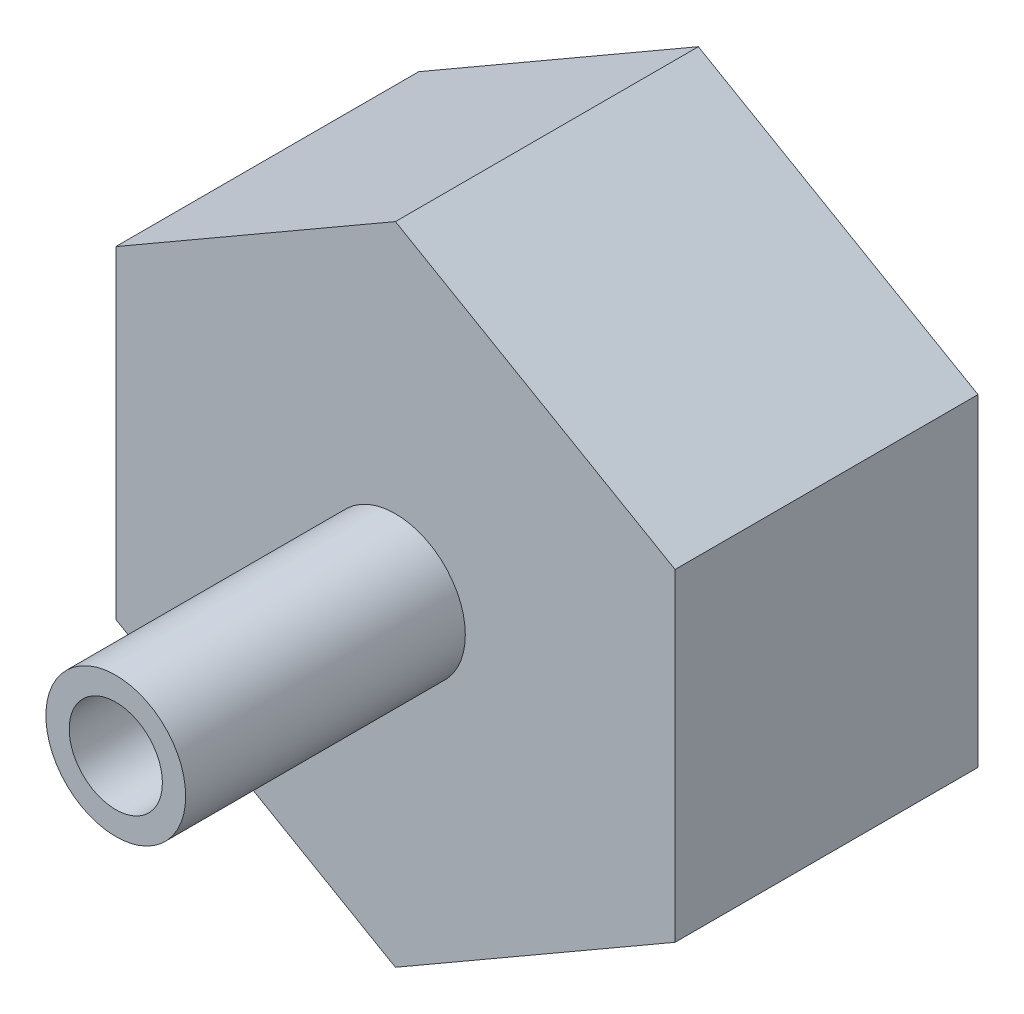
ISO-10303-21;
HEADER;
FILE_DESCRIPTION(('STEP AP214'),'2;1');
FILE_NAME('part.step','',(''),(''),'','','');
FILE_SCHEMA(('AUTOMOTIVE_DESIGN { 1 0 10303 214 1 1 1 1 }'));
ENDSEC;
DATA;
#1=APPLICATION_CONTEXT('core data for automotive mechanical design processes');
#2=APPLICATION_PROTOCOL_DEFINITION('international standard','automotive_design',2000,#1);
#3=PRODUCT_CONTEXT('',#1,'mechanical');
#4=PRODUCT('Part','Part','',(#3));
#5=PRODUCT_RELATED_PRODUCT_CATEGORY('part','',(#4));
#6=PRODUCT_DEFINITION_FORMATION('','',#4);
#7=PRODUCT_DEFINITION_CONTEXT('part definition',#1,'design');
#8=PRODUCT_DEFINITION('design','',#6,#7);
#9=PRODUCT_DEFINITION_SHAPE('','',#8);
#10=(LENGTH_UNIT() NAMED_UNIT(*) SI_UNIT(.MILLI.,.METRE.));
#11=(NAMED_UNIT(*) PLANE_ANGLE_UNIT() SI_UNIT($,.RADIAN.));
#12=(NAMED_UNIT(*) SI_UNIT($,.STERADIAN.) SOLID_ANGLE_UNIT());
#13=UNCERTAINTY_MEASURE_WITH_UNIT(LENGTH_MEASURE(1.E-05),#10,'distance_accuracy_value','');
#14=(GEOMETRIC_REPRESENTATION_CONTEXT(3) GLOBAL_UNCERTAINTY_ASSIGNED_CONTEXT((#13)) GLOBAL_UNIT_ASSIGNED_CONTEXT((#10,
#11,#12)) REPRESENTATION_CONTEXT('',''));
#15=CARTESIAN_POINT('',(0.,0.,0.));
#16=DIRECTION('',(0.,0.,1.));
#17=DIRECTION('',(1.,0.,0.));
#18=AXIS2_PLACEMENT_3D('',#15,#16,#17);
#19=CARTESIAN_POINT('',(12.,-6.92820323027552,13.));
#20=DIRECTION('',(-1.,0.,0.));
#21=DIRECTION('',(0.,-1.,0.));
#22=AXIS2_PLACEMENT_3D('',#19,#20,#21);
#23=PLANE('',#22);
#24=DIRECTION('',(0.,1.,0.));
#25=VECTOR('',#24,1.);
#26=CARTESIAN_POINT('',(12.,-6.92820323027552,0.));
#27=LINE('',#26,#25);
#28=CARTESIAN_POINT('',(12.,-6.92820323027552,0.));
#29=VERTEX_POINT('',#28);
#30=CARTESIAN_POINT('',(12.,6.92820323027551,0.));
#31=VERTEX_POINT('',#30);
#32=EDGE_CURVE('E129',#29,#31,#27,.T.);
#33=ORIENTED_EDGE('',*,*,#32,.T.);
#34=DIRECTION('',(0.,0.,-1.));
#35=VECTOR('',#34,1.);
#36=CARTESIAN_POINT('',(12.,6.92820323027551,13.));
#37=LINE('',#36,#35);
#38=CARTESIAN_POINT('',(12.,6.92820323027551,13.));
#39=VERTEX_POINT('',#38);
#40=EDGE_CURVE('E46',#39,#31,#37,.T.);
#41=ORIENTED_EDGE('',*,*,#40,.F.);
#42=DIRECTION('',(0.,1.,0.));
#43=VECTOR('',#42,1.);
#44=CARTESIAN_POINT('',(12.,-6.92820323027552,13.));
#45=LINE('',#44,#43);
#46=CARTESIAN_POINT('',(12.,-6.92820323027552,13.));
#47=VERTEX_POINT('',#46);
#48=EDGE_CURVE('E138',#47,#39,#45,.T.);
#49=ORIENTED_EDGE('',*,*,#48,.F.);
#50=DIRECTION('',(0.,0.,-1.));
#51=VECTOR('',#50,1.);
#52=CARTESIAN_POINT('',(12.,-6.92820323027552,13.));
#53=LINE('',#52,#51);
#54=EDGE_CURVE('E123',#47,#29,#53,.T.);
#55=ORIENTED_EDGE('',*,*,#54,.T.);
#56=EDGE_LOOP('',(#33,#41,#49,#55));
#57=FACE_BOUND('',#56,.T.);
#58=ADVANCED_FACE('F43',(#57),#23,.F.);
#59=CARTESIAN_POINT('',(12.,6.92820323027551,13.));
#60=DIRECTION('',(-0.5,-0.866025403784439,0.));
#61=DIRECTION('',(0.866025403784439,-0.5,0.));
#62=AXIS2_PLACEMENT_3D('',#59,#60,#61);
#63=PLANE('',#62);
#64=DIRECTION('',(-0.866025403784439,0.5,0.));
#65=VECTOR('',#64,1.);
#66=CARTESIAN_POINT('',(12.,6.92820323027551,0.));
#67=LINE('',#66,#65);
#68=CARTESIAN_POINT('',(0.,13.856406460551,0.));
#69=VERTEX_POINT('',#68);
#70=EDGE_CURVE('E135',#31,#69,#67,.T.);
#71=ORIENTED_EDGE('',*,*,#70,.T.);
#72=DIRECTION('',(0.,0.,-1.));
#73=VECTOR('',#72,1.);
#74=CARTESIAN_POINT('',(0.,13.856406460551,13.));
#75=LINE('',#74,#73);
#76=CARTESIAN_POINT('',(0.,13.856406460551,13.));
#77=VERTEX_POINT('',#76);
#78=EDGE_CURVE('E141',#77,#69,#75,.T.);
#79=ORIENTED_EDGE('',*,*,#78,.F.);
#80=DIRECTION('',(-0.866025403784439,0.5,0.));
#81=VECTOR('',#80,1.);
#82=CARTESIAN_POINT('',(12.,6.92820323027551,13.));
#83=LINE('',#82,#81);
#84=EDGE_CURVE('E98',#39,#77,#83,.T.);
#85=ORIENTED_EDGE('',*,*,#84,.F.);
#86=ORIENTED_EDGE('',*,*,#40,.T.);
#87=EDGE_LOOP('',(#71,#79,#85,#86));
#88=FACE_BOUND('',#87,.T.);
#89=ADVANCED_FACE('F146',(#88),#63,.F.);
#90=CARTESIAN_POINT('',(0.,13.856406460551,13.));
#91=DIRECTION('',(0.5,-0.866025403784439,0.));
#92=DIRECTION('',(0.866025403784439,0.5,0.));
#93=AXIS2_PLACEMENT_3D('',#90,#91,#92);
#94=PLANE('',#93);
#95=DIRECTION('',(-0.866025403784439,-0.5,0.));
#96=VECTOR('',#95,1.);
#97=CARTESIAN_POINT('',(0.,13.856406460551,0.));
#98=LINE('',#97,#96);
#99=CARTESIAN_POINT('',(-12.,6.92820323027551,0.));
#100=VERTEX_POINT('',#99);
#101=EDGE_CURVE('E134',#69,#100,#98,.T.);
#102=ORIENTED_EDGE('',*,*,#101,.T.);
#103=DIRECTION('',(0.,0.,-1.));
#104=VECTOR('',#103,1.);
#105=CARTESIAN_POINT('',(-12.,6.92820323027551,13.));
#106=LINE('',#105,#104);
#107=CARTESIAN_POINT('',(-12.,6.92820323027551,13.));
#108=VERTEX_POINT('',#107);
#109=EDGE_CURVE('E119',#108,#100,#106,.T.);
#110=ORIENTED_EDGE('',*,*,#109,.F.);
#111=DIRECTION('',(-0.866025403784439,-0.5,0.));
#112=VECTOR('',#111,1.);
#113=CARTESIAN_POINT('',(0.,13.856406460551,13.));
#114=LINE('',#113,#112);
#115=EDGE_CURVE('E112',#77,#108,#114,.T.);
#116=ORIENTED_EDGE('',*,*,#115,.F.);
#117=ORIENTED_EDGE('',*,*,#78,.T.);
#118=EDGE_LOOP('',(#102,#110,#116,#117));
#119=FACE_BOUND('',#118,.T.);
#120=ADVANCED_FACE('F152',(#119),#94,.F.);
#121=CARTESIAN_POINT('',(-12.,6.92820323027551,13.));
#122=DIRECTION('',(1.,0.,0.));
#123=DIRECTION('',(0.,1.,0.));
#124=AXIS2_PLACEMENT_3D('',#121,#122,#123);
#125=PLANE('',#124);
#126=DIRECTION('',(0.,-1.,0.));
#127=VECTOR('',#126,1.);
#128=CARTESIAN_POINT('',(-12.,6.92820323027551,0.));
#129=LINE('',#128,#127);
#130=CARTESIAN_POINT('',(-12.,-6.92820323027551,0.));
#131=VERTEX_POINT('',#130);
#132=EDGE_CURVE('E117',#100,#131,#129,.T.);
#133=ORIENTED_EDGE('',*,*,#132,.T.);
#134=DIRECTION('',(0.,0.,-1.));
#135=VECTOR('',#134,1.);
#136=CARTESIAN_POINT('',(-12.,-6.92820323027551,13.));
#137=LINE('',#136,#135);
#138=CARTESIAN_POINT('',(-12.,-6.92820323027551,13.));
#139=VERTEX_POINT('',#138);
#140=EDGE_CURVE('E118',#139,#131,#137,.T.);
#141=ORIENTED_EDGE('',*,*,#140,.F.);
#142=DIRECTION('',(0.,-1.,0.));
#143=VECTOR('',#142,1.);
#144=CARTESIAN_POINT('',(-12.,6.92820323027551,13.));
#145=LINE('',#144,#143);
#146=EDGE_CURVE('E104',#108,#139,#145,.T.);
#147=ORIENTED_EDGE('',*,*,#146,.F.);
#148=ORIENTED_EDGE('',*,*,#109,.T.);
#149=EDGE_LOOP('',(#133,#141,#147,#148));
#150=FACE_BOUND('',#149,.T.);
#151=ADVANCED_FACE('F120',(#150),#125,.F.);
#152=CARTESIAN_POINT('',(-12.,-6.92820323027551,13.));
#153=DIRECTION('',(0.5,0.866025403784439,0.));
#154=DIRECTION('',(-0.866025403784439,0.5,0.));
#155=AXIS2_PLACEMENT_3D('',#152,#153,#154);
#156=PLANE('',#155);
#157=DIRECTION('',(0.866025403784439,-0.5,0.));
#158=VECTOR('',#157,1.);
#159=CARTESIAN_POINT('',(-12.,-6.92820323027551,0.));
#160=LINE('',#159,#158);
#161=CARTESIAN_POINT('',(0.,-13.856406460551,0.));
#162=VERTEX_POINT('',#161);
#163=EDGE_CURVE('E85',#131,#162,#160,.T.);
#164=ORIENTED_EDGE('',*,*,#163,.T.);
#165=DIRECTION('',(0.,0.,-1.));
#166=VECTOR('',#165,1.);
#167=CARTESIAN_POINT('',(0.,-13.856406460551,13.));
#168=LINE('',#167,#166);
#169=CARTESIAN_POINT('',(0.,-13.856406460551,13.));
#170=VERTEX_POINT('',#169);
#171=EDGE_CURVE('E122',#170,#162,#168,.T.);
#172=ORIENTED_EDGE('',*,*,#171,.F.);
#173=DIRECTION('',(0.866025403784439,-0.5,0.));
#174=VECTOR('',#173,1.);
#175=CARTESIAN_POINT('',(-12.,-6.92820323027551,13.));
#176=LINE('',#175,#174);
#177=EDGE_CURVE('E108',#139,#170,#176,.T.);
#178=ORIENTED_EDGE('',*,*,#177,.F.);
#179=ORIENTED_EDGE('',*,*,#140,.T.);
#180=EDGE_LOOP('',(#164,#172,#178,#179));
#181=FACE_BOUND('',#180,.T.);
#182=ADVANCED_FACE('F125',(#181),#156,.F.);
#183=CARTESIAN_POINT('',(0.,-13.856406460551,13.));
#184=DIRECTION('',(-0.5,0.866025403784439,0.));
#185=DIRECTION('',(-0.866025403784439,-0.5,0.));
#186=AXIS2_PLACEMENT_3D('',#183,#184,#185);
#187=PLANE('',#186);
#188=DIRECTION('',(0.866025403784439,0.5,0.));
#189=VECTOR('',#188,1.);
#190=CARTESIAN_POINT('',(0.,-13.856406460551,0.));
#191=LINE('',#190,#189);
#192=EDGE_CURVE('E90',#162,#29,#191,.T.);
#193=ORIENTED_EDGE('',*,*,#192,.T.);
#194=ORIENTED_EDGE('',*,*,#54,.F.);
#195=DIRECTION('',(0.866025403784439,0.5,0.));
#196=VECTOR('',#195,1.);
#197=CARTESIAN_POINT('',(0.,-13.856406460551,13.));
#198=LINE('',#197,#196);
#199=EDGE_CURVE('E58',#170,#47,#198,.T.);
#200=ORIENTED_EDGE('',*,*,#199,.F.);
#201=ORIENTED_EDGE('',*,*,#171,.T.);
#202=EDGE_LOOP('',(#193,#194,#200,#201));
#203=FACE_BOUND('',#202,.T.);
#204=ADVANCED_FACE('F189',(#203),#187,.F.);
#205=CARTESIAN_POINT('',(0.,0.,13.));
#206=DIRECTION('',(0.,0.,1.));
#207=DIRECTION('',(1.,0.,0.));
#208=AXIS2_PLACEMENT_3D('',#205,#206,#207);
#209=PLANE('',#208);
#210=CARTESIAN_POINT('',(0.,0.,13.));
#211=DIRECTION('',(0.,0.,1.));
#212=DIRECTION('',(1.,0.,0.));
#213=AXIS2_PLACEMENT_3D('',#210,#211,#212);
#214=CIRCLE('',#213,3.);
#215=CARTESIAN_POINT('',(3.,0.,13.));
#216=VERTEX_POINT('',#215);
#217=EDGE_CURVE('E11',#216,#216,#214,.T.);
#218=ORIENTED_EDGE('',*,*,#217,.F.);
#219=EDGE_LOOP('',(#218));
#220=FACE_BOUND('',#219,.T.);
#221=ORIENTED_EDGE('',*,*,#48,.T.);
#222=ORIENTED_EDGE('',*,*,#84,.T.);
#223=ORIENTED_EDGE('',*,*,#115,.T.);
#224=ORIENTED_EDGE('',*,*,#146,.T.);
#225=ORIENTED_EDGE('',*,*,#177,.T.);
#226=ORIENTED_EDGE('',*,*,#199,.T.);
#227=EDGE_LOOP('',(#221,#222,#223,#224,#225,#226));
#228=FACE_BOUND('',#227,.T.);
#229=ADVANCED_FACE('F110',(#220,#228),#209,.T.);
#230=CARTESIAN_POINT('',(0.,0.,0.));
#231=DIRECTION('',(0.,0.,1.));
#232=DIRECTION('',(1.,0.,0.));
#233=AXIS2_PLACEMENT_3D('',#230,#231,#232);
#234=PLANE('',#233);
#235=CARTESIAN_POINT('',(0.,0.,0.));
#236=DIRECTION('',(0.,0.,1.));
#237=DIRECTION('',(1.,0.,0.));
#238=AXIS2_PLACEMENT_3D('',#235,#236,#237);
#239=CIRCLE('',#238,10.4775);
#240=CARTESIAN_POINT('',(10.4775,0.,0.));
#241=VERTEX_POINT('',#240);
#242=EDGE_CURVE('E158',#241,#241,#239,.T.);
#243=ORIENTED_EDGE('',*,*,#242,.T.);
#244=EDGE_LOOP('',(#243));
#245=FACE_BOUND('',#244,.T.);
#246=ORIENTED_EDGE('',*,*,#32,.F.);
#247=ORIENTED_EDGE('',*,*,#192,.F.);
#248=ORIENTED_EDGE('',*,*,#163,.F.);
#249=ORIENTED_EDGE('',*,*,#132,.F.);
#250=ORIENTED_EDGE('',*,*,#101,.F.);
#251=ORIENTED_EDGE('',*,*,#70,.F.);
#252=EDGE_LOOP('',(#246,#247,#248,#249,#250,#251));
#253=FACE_BOUND('',#252,.T.);
#254=ADVANCED_FACE('F153',(#245,#253),#234,.F.);
#255=CARTESIAN_POINT('',(0.,0.,11.));
#256=DIRECTION('',(0.,0.,-1.));
#257=DIRECTION('',(-1.,0.,0.));
#258=AXIS2_PLACEMENT_3D('',#255,#256,#257);
#259=CYLINDRICAL_SURFACE('',#258,10.4775);
#260=CARTESIAN_POINT('',(0.,0.,11.));
#261=DIRECTION('',(0.,0.,1.));
#262=DIRECTION('',(1.,0.,0.));
#263=AXIS2_PLACEMENT_3D('',#260,#261,#262);
#264=CIRCLE('',#263,10.4775);
#265=CARTESIAN_POINT('',(10.4775,0.,11.));
#266=VERTEX_POINT('',#265);
#267=EDGE_CURVE('E131',#266,#266,#264,.T.);
#268=ORIENTED_EDGE('',*,*,#267,.T.);
#269=EDGE_LOOP('',(#268));
#270=FACE_BOUND('',#269,.T.);
#271=ORIENTED_EDGE('',*,*,#242,.F.);
#272=EDGE_LOOP('',(#271));
#273=FACE_BOUND('',#272,.T.);
#274=ADVANCED_FACE('F198',(#270,#273),#259,.F.);
#275=CARTESIAN_POINT('',(0.,0.,11.));
#276=DIRECTION('',(0.,0.,1.));
#277=DIRECTION('',(1.,0.,0.));
#278=AXIS2_PLACEMENT_3D('',#275,#276,#277);
#279=PLANE('',#278);
#280=CARTESIAN_POINT('',(0.,0.,11.));
#281=DIRECTION('',(0.,0.,1.));
#282=DIRECTION('',(1.,0.,0.));
#283=AXIS2_PLACEMENT_3D('',#280,#281,#282);
#284=CIRCLE('',#283,2.);
#285=CARTESIAN_POINT('',(2.,0.,11.));
#286=VERTEX_POINT('',#285);
#287=EDGE_CURVE('E167',#286,#286,#284,.F.);
#288=ORIENTED_EDGE('',*,*,#287,.F.);
#289=EDGE_LOOP('',(#288));
#290=FACE_BOUND('',#289,.T.);
#291=ORIENTED_EDGE('',*,*,#267,.F.);
#292=EDGE_LOOP('',(#291));
#293=FACE_BOUND('',#292,.T.);
#294=ADVANCED_FACE('F183',(#290,#293),#279,.F.);
#295=CARTESIAN_POINT('',(0.,0.,25.));
#296=DIRECTION('',(0.,0.,-1.));
#297=DIRECTION('',(-1.,0.,0.));
#298=AXIS2_PLACEMENT_3D('',#295,#296,#297);
#299=CYLINDRICAL_SURFACE('',#298,3.);
#300=CARTESIAN_POINT('',(0.,0.,25.));
#301=DIRECTION('',(0.,0.,1.));
#302=DIRECTION('',(1.,0.,0.));
#303=AXIS2_PLACEMENT_3D('',#300,#301,#302);
#304=CIRCLE('',#303,3.);
#305=CARTESIAN_POINT('',(3.,0.,25.));
#306=VERTEX_POINT('',#305);
#307=EDGE_CURVE('E161',#306,#306,#304,.T.);
#308=ORIENTED_EDGE('',*,*,#307,.F.);
#309=EDGE_LOOP('',(#308));
#310=FACE_BOUND('',#309,.T.);
#311=ORIENTED_EDGE('',*,*,#217,.T.);
#312=EDGE_LOOP('',(#311));
#313=FACE_BOUND('',#312,.T.);
#314=ADVANCED_FACE('F176',(#310,#313),#299,.T.);
#315=CARTESIAN_POINT('',(0.,0.,25.));
#316=DIRECTION('',(0.,0.,1.));
#317=DIRECTION('',(1.,0.,0.));
#318=AXIS2_PLACEMENT_3D('',#315,#316,#317);
#319=PLANE('',#318);
#320=CARTESIAN_POINT('',(0.,0.,25.));
#321=DIRECTION('',(0.,0.,1.));
#322=DIRECTION('',(1.,0.,0.));
#323=AXIS2_PLACEMENT_3D('',#320,#321,#322);
#324=CIRCLE('',#323,2.);
#325=CARTESIAN_POINT('',(2.,0.,25.));
#326=VERTEX_POINT('',#325);
#327=EDGE_CURVE('E166',#326,#326,#324,.T.);
#328=ORIENTED_EDGE('',*,*,#327,.F.);
#329=EDGE_LOOP('',(#328));
#330=FACE_BOUND('',#329,.T.);
#331=ORIENTED_EDGE('',*,*,#307,.T.);
#332=EDGE_LOOP('',(#331));
#333=FACE_BOUND('',#332,.T.);
#334=ADVANCED_FACE('F177',(#330,#333),#319,.T.);
#335=CARTESIAN_POINT('',(0.,0.,25.));
#336=DIRECTION('',(0.,0.,-1.));
#337=DIRECTION('',(-1.,0.,0.));
#338=AXIS2_PLACEMENT_3D('',#335,#336,#337);
#339=CYLINDRICAL_SURFACE('',#338,2.);
#340=ORIENTED_EDGE('',*,*,#327,.T.);
#341=EDGE_LOOP('',(#340));
#342=FACE_BOUND('',#341,.T.);
#343=ORIENTED_EDGE('',*,*,#287,.T.);
#344=EDGE_LOOP('',(#343));
#345=FACE_BOUND('',#344,.T.);
#346=ADVANCED_FACE('F171',(#342,#345),#339,.F.);
#347=CLOSED_SHELL('',(#58,#89,#120,#151,#182,#204,#229,#254,#274,#294,#314,#334,#346));
#348=MANIFOLD_SOLID_BREP('B2',#347);
#349=ADVANCED_BREP_SHAPE_REPRESENTATION('',(#18,#348),#14);
#350=SHAPE_DEFINITION_REPRESENTATION(#9,#349);
ENDSEC;
END-ISO-10303-21;
